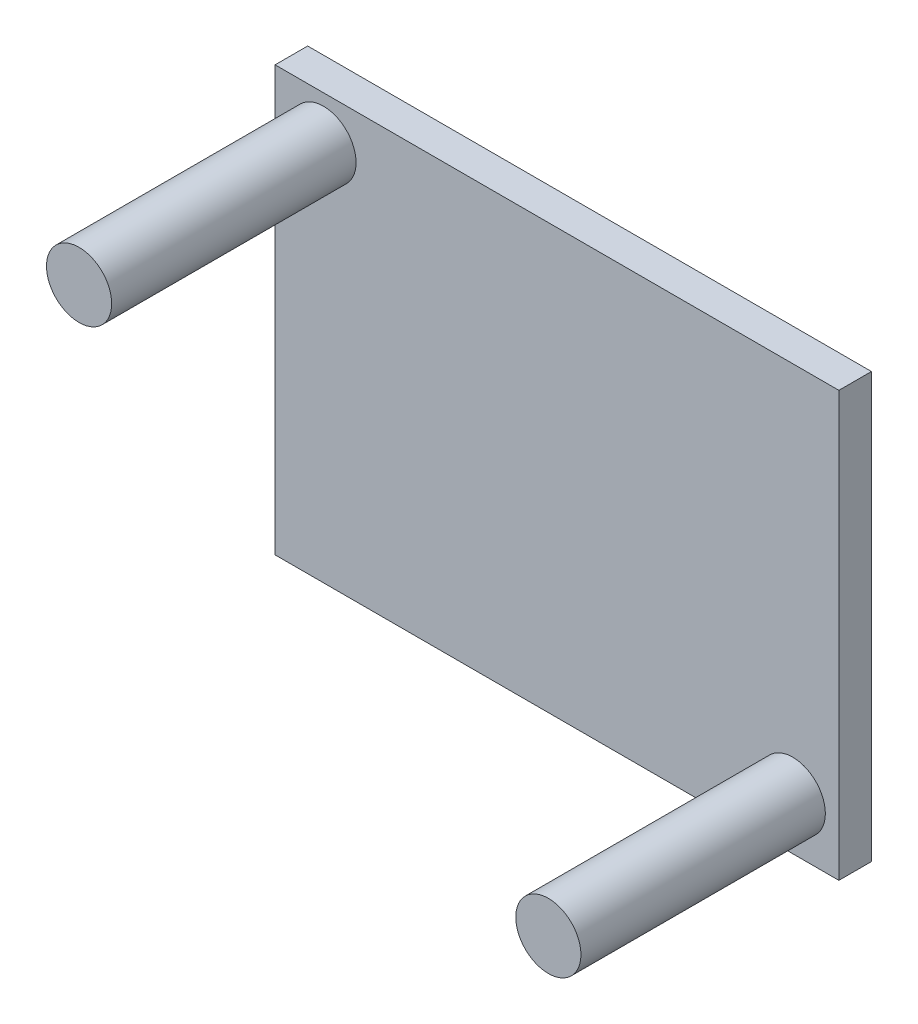
ISO-10303-21;
HEADER;
FILE_DESCRIPTION(('STEP AP214'),'2;1');
FILE_NAME('part.step','',(''),(''),'','','');
FILE_SCHEMA(('AUTOMOTIVE_DESIGN { 1 0 10303 214 1 1 1 1 }'));
ENDSEC;
DATA;
#1=APPLICATION_CONTEXT('core data for automotive mechanical design processes');
#2=APPLICATION_PROTOCOL_DEFINITION('international standard','automotive_design',2000,#1);
#3=PRODUCT_CONTEXT('',#1,'mechanical');
#4=PRODUCT('Part','Part','',(#3));
#5=PRODUCT_RELATED_PRODUCT_CATEGORY('part','',(#4));
#6=PRODUCT_DEFINITION_FORMATION('','',#4);
#7=PRODUCT_DEFINITION_CONTEXT('part definition',#1,'design');
#8=PRODUCT_DEFINITION('design','',#6,#7);
#9=PRODUCT_DEFINITION_SHAPE('','',#8);
#10=(LENGTH_UNIT() NAMED_UNIT(*) SI_UNIT(.MILLI.,.METRE.));
#11=(NAMED_UNIT(*) PLANE_ANGLE_UNIT() SI_UNIT($,.RADIAN.));
#12=(NAMED_UNIT(*) SI_UNIT($,.STERADIAN.) SOLID_ANGLE_UNIT());
#13=UNCERTAINTY_MEASURE_WITH_UNIT(LENGTH_MEASURE(1.E-05),#10,'distance_accuracy_value','');
#14=(GEOMETRIC_REPRESENTATION_CONTEXT(3) GLOBAL_UNCERTAINTY_ASSIGNED_CONTEXT((#13)) GLOBAL_UNIT_ASSIGNED_CONTEXT((#10,
#11,#12)) REPRESENTATION_CONTEXT('',''));
#15=CARTESIAN_POINT('',(0.,0.,0.));
#16=DIRECTION('',(0.,0.,1.));
#17=DIRECTION('',(1.,0.,0.));
#18=AXIS2_PLACEMENT_3D('',#15,#16,#17);
#19=CARTESIAN_POINT('',(0.,0.,15.));
#20=DIRECTION('',(0.,0.,-1.));
#21=DIRECTION('',(-1.,0.,0.));
#22=AXIS2_PLACEMENT_3D('',#19,#20,#21);
#23=CYLINDRICAL_SURFACE('',#22,2.);
#24=CARTESIAN_POINT('',(0.,0.,15.));
#25=DIRECTION('',(0.,0.,1.));
#26=DIRECTION('',(1.,0.,0.));
#27=AXIS2_PLACEMENT_3D('',#24,#25,#26);
#28=CIRCLE('',#27,2.);
#29=CARTESIAN_POINT('',(2.,0.,15.));
#30=VERTEX_POINT('',#29);
#31=EDGE_CURVE('E11',#30,#30,#28,.T.);
#32=ORIENTED_EDGE('',*,*,#31,.F.);
#33=EDGE_LOOP('',(#32));
#34=FACE_BOUND('',#33,.T.);
#35=CARTESIAN_POINT('',(0.,0.,0.));
#36=DIRECTION('',(0.,0.,1.));
#37=DIRECTION('',(1.,0.,0.));
#38=AXIS2_PLACEMENT_3D('',#35,#36,#37);
#39=CIRCLE('',#38,2.);
#40=CARTESIAN_POINT('',(2.,0.,0.));
#41=VERTEX_POINT('',#40);
#42=EDGE_CURVE('E35',#41,#41,#39,.T.);
#43=ORIENTED_EDGE('',*,*,#42,.T.);
#44=EDGE_LOOP('',(#43));
#45=FACE_BOUND('',#44,.T.);
#46=ADVANCED_FACE('F32',(#34,#45),#23,.T.);
#47=CARTESIAN_POINT('',(0.,0.,15.));
#48=DIRECTION('',(0.,0.,1.));
#49=DIRECTION('',(1.,0.,0.));
#50=AXIS2_PLACEMENT_3D('',#47,#48,#49);
#51=PLANE('',#50);
#52=ORIENTED_EDGE('',*,*,#31,.T.);
#53=EDGE_LOOP('',(#52));
#54=FACE_BOUND('',#53,.T.);
#55=ADVANCED_FACE('F122',(#54),#51,.T.);
#56=CARTESIAN_POINT('',(-2.96989764351004,2.71270956347711,-2.));
#57=DIRECTION('',(-1.,0.,0.));
#58=DIRECTION('',(0.,0.,1.));
#59=AXIS2_PLACEMENT_3D('',#56,#57,#58);
#60=PLANE('',#59);
#61=DIRECTION('',(0.,-1.,0.));
#62=VECTOR('',#61,1.);
#63=CARTESIAN_POINT('',(-2.96989764351004,2.71270956347711,0.));
#64=LINE('',#63,#62);
#65=CARTESIAN_POINT('',(-2.96989764351004,2.71270956347711,0.));
#66=VERTEX_POINT('',#65);
#67=CARTESIAN_POINT('',(-2.96989764351004,-23.3333730785571,0.));
#68=VERTEX_POINT('',#67);
#69=EDGE_CURVE('E100',#66,#68,#64,.T.);
#70=ORIENTED_EDGE('',*,*,#69,.F.);
#71=DIRECTION('',(0.,0.,1.));
#72=VECTOR('',#71,1.);
#73=CARTESIAN_POINT('',(-2.96989764351004,2.71270956347711,-2.));
#74=LINE('',#73,#72);
#75=CARTESIAN_POINT('',(-2.96989764351004,2.71270956347711,-2.));
#76=VERTEX_POINT('',#75);
#77=EDGE_CURVE('E48',#76,#66,#74,.T.);
#78=ORIENTED_EDGE('',*,*,#77,.F.);
#79=DIRECTION('',(0.,-1.,0.));
#80=VECTOR('',#79,1.);
#81=CARTESIAN_POINT('',(-2.96989764351004,2.71270956347711,-2.));
#82=LINE('',#81,#80);
#83=CARTESIAN_POINT('',(-2.96989764351004,-23.3333730785571,-2.));
#84=VERTEX_POINT('',#83);
#85=EDGE_CURVE('E93',#76,#84,#82,.T.);
#86=ORIENTED_EDGE('',*,*,#85,.T.);
#87=DIRECTION('',(0.,0.,1.));
#88=VECTOR('',#87,1.);
#89=CARTESIAN_POINT('',(-2.96989764351004,-23.3333730785571,-2.));
#90=LINE('',#89,#88);
#91=EDGE_CURVE('E76',#84,#68,#90,.T.);
#92=ORIENTED_EDGE('',*,*,#91,.T.);
#93=EDGE_LOOP('',(#70,#78,#86,#92));
#94=FACE_BOUND('',#93,.T.);
#95=ADVANCED_FACE('F111',(#94),#60,.T.);
#96=CARTESIAN_POINT('',(-2.96989764351004,2.71270956347711,-2.));
#97=DIRECTION('',(0.,1.,0.));
#98=DIRECTION('',(0.,0.,1.));
#99=AXIS2_PLACEMENT_3D('',#96,#97,#98);
#100=PLANE('',#99);
#101=DIRECTION('',(-1.,0.,0.));
#102=VECTOR('',#101,1.);
#103=CARTESIAN_POINT('',(-2.96989764351004,2.71270956347711,0.));
#104=LINE('',#103,#102);
#105=CARTESIAN_POINT('',(31.6296764718167,2.71270956347711,0.));
#106=VERTEX_POINT('',#105);
#107=EDGE_CURVE('E95',#106,#66,#104,.T.);
#108=ORIENTED_EDGE('',*,*,#107,.F.);
#109=DIRECTION('',(0.,0.,1.));
#110=VECTOR('',#109,1.);
#111=CARTESIAN_POINT('',(31.6296764718167,2.71270956347711,-2.));
#112=LINE('',#111,#110);
#113=CARTESIAN_POINT('',(31.6296764718167,2.71270956347711,-2.));
#114=VERTEX_POINT('',#113);
#115=EDGE_CURVE('E65',#114,#106,#112,.T.);
#116=ORIENTED_EDGE('',*,*,#115,.F.);
#117=DIRECTION('',(-1.,0.,0.));
#118=VECTOR('',#117,1.);
#119=CARTESIAN_POINT('',(-2.96989764351004,2.71270956347711,-2.));
#120=LINE('',#119,#118);
#121=EDGE_CURVE('E90',#114,#76,#120,.T.);
#122=ORIENTED_EDGE('',*,*,#121,.T.);
#123=ORIENTED_EDGE('',*,*,#77,.T.);
#124=EDGE_LOOP('',(#108,#116,#122,#123));
#125=FACE_BOUND('',#124,.T.);
#126=ADVANCED_FACE('F114',(#125),#100,.T.);
#127=CARTESIAN_POINT('',(31.6296764718167,2.71270956347711,-2.));
#128=DIRECTION('',(1.,0.,0.));
#129=DIRECTION('',(0.,0.,-1.));
#130=AXIS2_PLACEMENT_3D('',#127,#128,#129);
#131=PLANE('',#130);
#132=DIRECTION('',(0.,1.,0.));
#133=VECTOR('',#132,1.);
#134=CARTESIAN_POINT('',(31.6296764718167,2.71270956347711,0.));
#135=LINE('',#134,#133);
#136=CARTESIAN_POINT('',(31.6296764718167,-23.3333730785571,0.));
#137=VERTEX_POINT('',#136);
#138=EDGE_CURVE('E84',#137,#106,#135,.T.);
#139=ORIENTED_EDGE('',*,*,#138,.F.);
#140=DIRECTION('',(0.,0.,1.));
#141=VECTOR('',#140,1.);
#142=CARTESIAN_POINT('',(31.6296764718167,-23.3333730785571,-2.));
#143=LINE('',#142,#141);
#144=CARTESIAN_POINT('',(31.6296764718167,-23.3333730785571,-2.));
#145=VERTEX_POINT('',#144);
#146=EDGE_CURVE('E79',#145,#137,#143,.T.);
#147=ORIENTED_EDGE('',*,*,#146,.F.);
#148=DIRECTION('',(0.,1.,0.));
#149=VECTOR('',#148,1.);
#150=CARTESIAN_POINT('',(31.6296764718167,2.71270956347711,-2.));
#151=LINE('',#150,#149);
#152=EDGE_CURVE('E82',#145,#114,#151,.T.);
#153=ORIENTED_EDGE('',*,*,#152,.T.);
#154=ORIENTED_EDGE('',*,*,#115,.T.);
#155=EDGE_LOOP('',(#139,#147,#153,#154));
#156=FACE_BOUND('',#155,.T.);
#157=ADVANCED_FACE('F81',(#156),#131,.T.);
#158=CARTESIAN_POINT('',(-2.96989764351004,-23.3333730785571,-2.));
#159=DIRECTION('',(0.,-1.,0.));
#160=DIRECTION('',(0.,0.,-1.));
#161=AXIS2_PLACEMENT_3D('',#158,#159,#160);
#162=PLANE('',#161);
#163=DIRECTION('',(1.,0.,0.));
#164=VECTOR('',#163,1.);
#165=CARTESIAN_POINT('',(-2.96989764351004,-23.3333730785571,0.));
#166=LINE('',#165,#164);
#167=EDGE_CURVE('E103',#68,#137,#166,.T.);
#168=ORIENTED_EDGE('',*,*,#167,.F.);
#169=ORIENTED_EDGE('',*,*,#91,.F.);
#170=DIRECTION('',(1.,0.,0.));
#171=VECTOR('',#170,1.);
#172=CARTESIAN_POINT('',(-2.96989764351004,-23.3333730785571,-2.));
#173=LINE('',#172,#171);
#174=EDGE_CURVE('E89',#84,#145,#173,.T.);
#175=ORIENTED_EDGE('',*,*,#174,.T.);
#176=ORIENTED_EDGE('',*,*,#146,.T.);
#177=EDGE_LOOP('',(#168,#169,#175,#176));
#178=FACE_BOUND('',#177,.T.);
#179=ADVANCED_FACE('F92',(#178),#162,.T.);
#180=CARTESIAN_POINT('',(0.,0.,-2.));
#181=DIRECTION('',(0.,0.,1.));
#182=DIRECTION('',(1.,0.,0.));
#183=AXIS2_PLACEMENT_3D('',#180,#181,#182);
#184=PLANE('',#183);
#185=ORIENTED_EDGE('',*,*,#85,.F.);
#186=ORIENTED_EDGE('',*,*,#121,.F.);
#187=ORIENTED_EDGE('',*,*,#152,.F.);
#188=ORIENTED_EDGE('',*,*,#174,.F.);
#189=EDGE_LOOP('',(#185,#186,#187,#188));
#190=FACE_BOUND('',#189,.T.);
#191=ADVANCED_FACE('F88',(#190),#184,.F.);
#192=CARTESIAN_POINT('',(0.,0.,0.));
#193=DIRECTION('',(0.,0.,1.));
#194=DIRECTION('',(1.,0.,0.));
#195=AXIS2_PLACEMENT_3D('',#192,#193,#194);
#196=PLANE('',#195);
#197=CARTESIAN_POINT('',(28.8,-20.2,0.));
#198=DIRECTION('',(0.,0.,1.));
#199=DIRECTION('',(1.,0.,0.));
#200=AXIS2_PLACEMENT_3D('',#197,#198,#199);
#201=CIRCLE('',#200,2.);
#202=CARTESIAN_POINT('',(30.8,-20.2,0.));
#203=VERTEX_POINT('',#202);
#204=EDGE_CURVE('E155',#203,#203,#201,.T.);
#205=ORIENTED_EDGE('',*,*,#204,.F.);
#206=EDGE_LOOP('',(#205));
#207=FACE_BOUND('',#206,.T.);
#208=ORIENTED_EDGE('',*,*,#42,.F.);
#209=EDGE_LOOP('',(#208));
#210=FACE_BOUND('',#209,.T.);
#211=ORIENTED_EDGE('',*,*,#69,.T.);
#212=ORIENTED_EDGE('',*,*,#167,.T.);
#213=ORIENTED_EDGE('',*,*,#138,.T.);
#214=ORIENTED_EDGE('',*,*,#107,.T.);
#215=EDGE_LOOP('',(#211,#212,#213,#214));
#216=FACE_BOUND('',#215,.T.);
#217=ADVANCED_FACE('F113',(#207,#210,#216),#196,.T.);
#218=CARTESIAN_POINT('',(28.8,-20.2,15.));
#219=DIRECTION('',(0.,0.,-1.));
#220=DIRECTION('',(-1.,0.,0.));
#221=AXIS2_PLACEMENT_3D('',#218,#219,#220);
#222=CYLINDRICAL_SURFACE('',#221,2.);
#223=CARTESIAN_POINT('',(28.8,-20.2,15.));
#224=DIRECTION('',(0.,0.,1.));
#225=DIRECTION('',(1.,0.,0.));
#226=AXIS2_PLACEMENT_3D('',#223,#224,#225);
#227=CIRCLE('',#226,2.);
#228=CARTESIAN_POINT('',(30.8,-20.2,15.));
#229=VERTEX_POINT('',#228);
#230=EDGE_CURVE('E104',#229,#229,#227,.T.);
#231=ORIENTED_EDGE('',*,*,#230,.F.);
#232=EDGE_LOOP('',(#231));
#233=FACE_BOUND('',#232,.T.);
#234=ORIENTED_EDGE('',*,*,#204,.T.);
#235=EDGE_LOOP('',(#234));
#236=FACE_BOUND('',#235,.T.);
#237=ADVANCED_FACE('F137',(#233,#236),#222,.T.);
#238=CARTESIAN_POINT('',(28.8,-20.2,15.));
#239=DIRECTION('',(0.,0.,1.));
#240=DIRECTION('',(1.,0.,0.));
#241=AXIS2_PLACEMENT_3D('',#238,#239,#240);
#242=PLANE('',#241);
#243=ORIENTED_EDGE('',*,*,#230,.T.);
#244=EDGE_LOOP('',(#243));
#245=FACE_BOUND('',#244,.T.);
#246=ADVANCED_FACE('F143',(#245),#242,.T.);
#247=CLOSED_SHELL('',(#46,#55,#95,#126,#157,#179,#191,#217,#237,#246));
#248=MANIFOLD_SOLID_BREP('B2',#247);
#249=ADVANCED_BREP_SHAPE_REPRESENTATION('',(#18,#248),#14);
#250=SHAPE_DEFINITION_REPRESENTATION(#9,#249);
ENDSEC;
END-ISO-10303-21;
